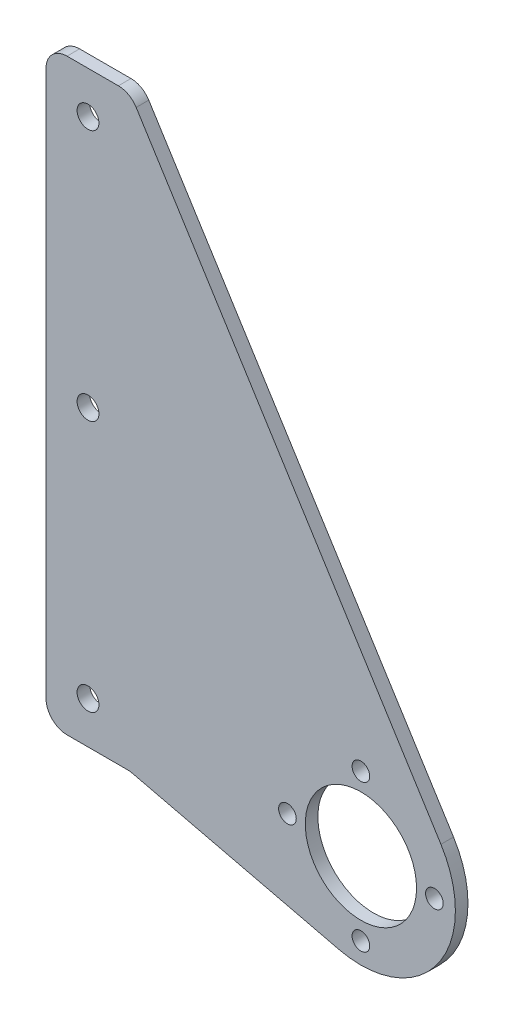
ISO-10303-21;
HEADER;
FILE_DESCRIPTION(('STEP AP214'),'2;1');
FILE_NAME('part.step','',(''),(''),'','','');
FILE_SCHEMA(('AUTOMOTIVE_DESIGN { 1 0 10303 214 1 1 1 1 }'));
ENDSEC;
DATA;
#1=APPLICATION_CONTEXT('core data for automotive mechanical design processes');
#2=APPLICATION_PROTOCOL_DEFINITION('international standard','automotive_design',2000,#1);
#3=PRODUCT_CONTEXT('',#1,'mechanical');
#4=PRODUCT('Part','Part','',(#3));
#5=PRODUCT_RELATED_PRODUCT_CATEGORY('part','',(#4));
#6=PRODUCT_DEFINITION_FORMATION('','',#4);
#7=PRODUCT_DEFINITION_CONTEXT('part definition',#1,'design');
#8=PRODUCT_DEFINITION('design','',#6,#7);
#9=PRODUCT_DEFINITION_SHAPE('','',#8);
#10=(LENGTH_UNIT() NAMED_UNIT(*) SI_UNIT(.MILLI.,.METRE.));
#11=(NAMED_UNIT(*) PLANE_ANGLE_UNIT() SI_UNIT($,.RADIAN.));
#12=(NAMED_UNIT(*) SI_UNIT($,.STERADIAN.) SOLID_ANGLE_UNIT());
#13=UNCERTAINTY_MEASURE_WITH_UNIT(LENGTH_MEASURE(1.E-05),#10,'distance_accuracy_value','');
#14=(GEOMETRIC_REPRESENTATION_CONTEXT(3) GLOBAL_UNCERTAINTY_ASSIGNED_CONTEXT((#13)) GLOBAL_UNIT_ASSIGNED_CONTEXT((#10,
#11,#12)) REPRESENTATION_CONTEXT('',''));
#15=CARTESIAN_POINT('',(0.,0.,0.));
#16=DIRECTION('',(0.,0.,1.));
#17=DIRECTION('',(1.,0.,0.));
#18=AXIS2_PLACEMENT_3D('',#15,#16,#17);
#19=CARTESIAN_POINT('',(0.,0.,3.));
#20=DIRECTION('',(0.,0.,1.));
#21=DIRECTION('',(1.,0.,0.));
#22=AXIS2_PLACEMENT_3D('',#19,#20,#21);
#23=PLANE('',#22);
#24=CARTESIAN_POINT('',(-65.,120.,3.));
#25=DIRECTION('',(0.,0.,1.));
#26=DIRECTION('',(1.,0.,0.));
#27=AXIS2_PLACEMENT_3D('',#24,#25,#26);
#28=CIRCLE('',#27,2.59999999999999);
#29=CARTESIAN_POINT('',(-62.4,120.,3.));
#30=VERTEX_POINT('',#29);
#31=EDGE_CURVE('E343',#30,#30,#28,.T.);
#32=ORIENTED_EDGE('',*,*,#31,.F.);
#33=EDGE_LOOP('',(#32));
#34=FACE_BOUND('',#33,.T.);
#35=CARTESIAN_POINT('',(-17.5,0.,3.));
#36=DIRECTION('',(0.,0.,1.));
#37=DIRECTION('',(1.,0.,0.));
#38=AXIS2_PLACEMENT_3D('',#35,#36,#37);
#39=CIRCLE('',#38,2.1);
#40=CARTESIAN_POINT('',(-15.4,0.,3.));
#41=VERTEX_POINT('',#40);
#42=EDGE_CURVE('E327',#41,#41,#39,.T.);
#43=ORIENTED_EDGE('',*,*,#42,.F.);
#44=EDGE_LOOP('',(#43));
#45=FACE_BOUND('',#44,.T.);
#46=CARTESIAN_POINT('',(17.5,0.,3.));
#47=DIRECTION('',(0.,0.,1.));
#48=DIRECTION('',(1.,0.,0.));
#49=AXIS2_PLACEMENT_3D('',#46,#47,#48);
#50=CIRCLE('',#49,2.1);
#51=CARTESIAN_POINT('',(19.6,0.,3.));
#52=VERTEX_POINT('',#51);
#53=EDGE_CURVE('E311',#52,#52,#50,.T.);
#54=ORIENTED_EDGE('',*,*,#53,.F.);
#55=EDGE_LOOP('',(#54));
#56=FACE_BOUND('',#55,.T.);
#57=CARTESIAN_POINT('',(0.,0.,3.));
#58=DIRECTION('',(0.,0.,1.));
#59=DIRECTION('',(1.,0.,0.));
#60=AXIS2_PLACEMENT_3D('',#57,#58,#59);
#61=CIRCLE('',#60,13.25);
#62=CARTESIAN_POINT('',(13.25,0.,3.));
#63=VERTEX_POINT('',#62);
#64=EDGE_CURVE('E163',#63,#63,#61,.T.);
#65=ORIENTED_EDGE('',*,*,#64,.F.);
#66=EDGE_LOOP('',(#65));
#67=FACE_BOUND('',#66,.T.);
#68=DIRECTION('',(-0.53145870163887,0.847084203873692,0.));
#69=VECTOR('',#68,1.);
#70=CARTESIAN_POINT('',(-55.,130.,3.));
#71=LINE('',#70,#69);
#72=CARTESIAN_POINT('',(19.0593945871581,11.9578207868746,3.));
#73=VERTEX_POINT('',#72);
#74=CARTESIAN_POINT('',(-53.5301912787862,127.657293508194,3.));
#75=VERTEX_POINT('',#74);
#76=EDGE_CURVE('E152',#73,#75,#71,.T.);
#77=ORIENTED_EDGE('',*,*,#76,.T.);
#78=CARTESIAN_POINT('',(-57.7656122981547,125.,3.));
#79=DIRECTION('',(0.,0.,1.));
#80=DIRECTION('',(1.,0.,0.));
#81=AXIS2_PLACEMENT_3D('',#78,#79,#80);
#82=CIRCLE('',#81,5.);
#83=CARTESIAN_POINT('',(-57.7656122981547,130.,3.));
#84=VERTEX_POINT('',#83);
#85=EDGE_CURVE('E215',#75,#84,#82,.T.);
#86=ORIENTED_EDGE('',*,*,#85,.T.);
#87=DIRECTION('',(-1.,0.,0.));
#88=VECTOR('',#87,1.);
#89=CARTESIAN_POINT('',(-75.,130.,3.));
#90=LINE('',#89,#88);
#91=CARTESIAN_POINT('',(-70.,130.,3.));
#92=VERTEX_POINT('',#91);
#93=EDGE_CURVE('E179',#84,#92,#90,.T.);
#94=ORIENTED_EDGE('',*,*,#93,.T.);
#95=CARTESIAN_POINT('',(-70.,125.,3.));
#96=DIRECTION('',(0.,0.,1.));
#97=DIRECTION('',(1.,0.,0.));
#98=AXIS2_PLACEMENT_3D('',#95,#96,#97);
#99=CIRCLE('',#98,5.);
#100=CARTESIAN_POINT('',(-75.,125.,3.));
#101=VERTEX_POINT('',#100);
#102=EDGE_CURVE('E68',#92,#101,#99,.T.);
#103=ORIENTED_EDGE('',*,*,#102,.T.);
#104=DIRECTION('',(0.,-1.,0.));
#105=VECTOR('',#104,1.);
#106=CARTESIAN_POINT('',(-75.,130.,3.));
#107=LINE('',#106,#105);
#108=CARTESIAN_POINT('',(-75.,-5.,3.));
#109=VERTEX_POINT('',#108);
#110=EDGE_CURVE('E285',#101,#109,#107,.T.);
#111=ORIENTED_EDGE('',*,*,#110,.T.);
#112=CARTESIAN_POINT('',(-70.,-5.00000000000001,3.));
#113=DIRECTION('',(0.,0.,1.));
#114=DIRECTION('',(1.,0.,0.));
#115=AXIS2_PLACEMENT_3D('',#112,#113,#114);
#116=CIRCLE('',#115,5.);
#117=CARTESIAN_POINT('',(-70.,-10.,3.));
#118=VERTEX_POINT('',#117);
#119=EDGE_CURVE('E212',#109,#118,#116,.T.);
#120=ORIENTED_EDGE('',*,*,#119,.T.);
#121=DIRECTION('',(1.,0.,0.));
#122=VECTOR('',#121,1.);
#123=CARTESIAN_POINT('',(-75.,-10.,3.));
#124=LINE('',#123,#122);
#125=CARTESIAN_POINT('',(-55.5886578882851,-10.,3.));
#126=VERTEX_POINT('',#125);
#127=EDGE_CURVE('E135',#118,#126,#124,.T.);
#128=ORIENTED_EDGE('',*,*,#127,.T.);
#129=CARTESIAN_POINT('',(-55.5886578882851,-15.,3.));
#130=DIRECTION('',(0.,0.,1.));
#131=DIRECTION('',(1.,0.,0.));
#132=AXIS2_PLACEMENT_3D('',#129,#130,#131);
#133=CIRCLE('',#132,5.);
#134=CARTESIAN_POINT('',(-54.4274374679034,-10.1367123120991,3.));
#135=VERTEX_POINT('',#134);
#136=EDGE_CURVE('E11',#126,#135,#133,.F.);
#137=ORIENTED_EDGE('',*,*,#136,.T.);
#138=DIRECTION('',(0.972657537580184,-0.23224408407633,0.));
#139=VECTOR('',#138,1.);
#140=CARTESIAN_POINT('',(-55.,-10.,3.));
#141=LINE('',#140,#139);
#142=CARTESIAN_POINT('',(-5.22549189171743,-21.8847945955541,3.));
#143=VERTEX_POINT('',#142);
#144=EDGE_CURVE('E122',#135,#143,#141,.T.);
#145=ORIENTED_EDGE('',*,*,#144,.T.);
#146=CARTESIAN_POINT('',(0.,0.,3.));
#147=DIRECTION('',(0.,0.,1.));
#148=DIRECTION('',(1.,0.,0.));
#149=AXIS2_PLACEMENT_3D('',#146,#147,#148);
#150=CIRCLE('',#149,22.5);
#151=EDGE_CURVE('E127',#143,#73,#150,.T.);
#152=ORIENTED_EDGE('',*,*,#151,.T.);
#153=EDGE_LOOP('',(#77,#86,#94,#103,#111,#120,#128,#137,#145,#152));
#154=FACE_BOUND('',#153,.T.);
#155=CARTESIAN_POINT('',(0.,17.5,3.));
#156=DIRECTION('',(0.,0.,1.));
#157=DIRECTION('',(1.,0.,0.));
#158=AXIS2_PLACEMENT_3D('',#155,#156,#157);
#159=CIRCLE('',#158,2.1);
#160=CARTESIAN_POINT('',(2.09999999999993,17.5,3.));
#161=VERTEX_POINT('',#160);
#162=EDGE_CURVE('E303',#161,#161,#159,.T.);
#163=ORIENTED_EDGE('',*,*,#162,.F.);
#164=EDGE_LOOP('',(#163));
#165=FACE_BOUND('',#164,.T.);
#166=CARTESIAN_POINT('',(0.,-17.5,3.));
#167=DIRECTION('',(0.,0.,1.));
#168=DIRECTION('',(1.,0.,0.));
#169=AXIS2_PLACEMENT_3D('',#166,#167,#168);
#170=CIRCLE('',#169,2.1);
#171=CARTESIAN_POINT('',(2.10000000000007,-17.5,3.));
#172=VERTEX_POINT('',#171);
#173=EDGE_CURVE('E319',#172,#172,#170,.T.);
#174=ORIENTED_EDGE('',*,*,#173,.F.);
#175=EDGE_LOOP('',(#174));
#176=FACE_BOUND('',#175,.T.);
#177=CARTESIAN_POINT('',(-65.,60.,3.));
#178=DIRECTION('',(0.,0.,1.));
#179=DIRECTION('',(1.,0.,0.));
#180=AXIS2_PLACEMENT_3D('',#177,#178,#179);
#181=CIRCLE('',#180,2.59999999999999);
#182=CARTESIAN_POINT('',(-62.4,60.,3.));
#183=VERTEX_POINT('',#182);
#184=EDGE_CURVE('E335',#183,#183,#181,.T.);
#185=ORIENTED_EDGE('',*,*,#184,.F.);
#186=EDGE_LOOP('',(#185));
#187=FACE_BOUND('',#186,.T.);
#188=CARTESIAN_POINT('',(-65.,0.,3.));
#189=DIRECTION('',(0.,0.,1.));
#190=DIRECTION('',(1.,0.,0.));
#191=AXIS2_PLACEMENT_3D('',#188,#189,#190);
#192=CIRCLE('',#191,2.59999999999999);
#193=CARTESIAN_POINT('',(-62.4,0.,3.));
#194=VERTEX_POINT('',#193);
#195=EDGE_CURVE('E351',#194,#194,#192,.T.);
#196=ORIENTED_EDGE('',*,*,#195,.F.);
#197=EDGE_LOOP('',(#196));
#198=FACE_BOUND('',#197,.T.);
#199=ADVANCED_FACE('F45',(#34,#45,#56,#67,#154,#165,#176,#187,#198),#23,.T.);
#200=CARTESIAN_POINT('',(0.,0.,0.));
#201=DIRECTION('',(0.,0.,1.));
#202=DIRECTION('',(1.,0.,0.));
#203=AXIS2_PLACEMENT_3D('',#200,#201,#202);
#204=PLANE('',#203);
#205=DIRECTION('',(-1.,0.,0.));
#206=VECTOR('',#205,1.);
#207=CARTESIAN_POINT('',(-75.,130.,0.));
#208=LINE('',#207,#206);
#209=CARTESIAN_POINT('',(-57.7656122981547,130.,0.));
#210=VERTEX_POINT('',#209);
#211=CARTESIAN_POINT('',(-70.,130.,0.));
#212=VERTEX_POINT('',#211);
#213=EDGE_CURVE('E158',#210,#212,#208,.T.);
#214=ORIENTED_EDGE('',*,*,#213,.F.);
#215=CARTESIAN_POINT('',(-57.7656122981547,125.,0.));
#216=DIRECTION('',(0.,0.,1.));
#217=DIRECTION('',(1.,0.,0.));
#218=AXIS2_PLACEMENT_3D('',#215,#216,#217);
#219=CIRCLE('',#218,5.);
#220=CARTESIAN_POINT('',(-53.5301912787862,127.657293508194,0.));
#221=VERTEX_POINT('',#220);
#222=EDGE_CURVE('E204',#210,#221,#219,.F.);
#223=ORIENTED_EDGE('',*,*,#222,.T.);
#224=DIRECTION('',(-0.53145870163887,0.847084203873692,0.));
#225=VECTOR('',#224,1.);
#226=CARTESIAN_POINT('',(-55.,130.,0.));
#227=LINE('',#226,#225);
#228=CARTESIAN_POINT('',(19.0593945871581,11.9578207868746,0.));
#229=VERTEX_POINT('',#228);
#230=EDGE_CURVE('E175',#229,#221,#227,.T.);
#231=ORIENTED_EDGE('',*,*,#230,.F.);
#232=CARTESIAN_POINT('',(0.,0.,0.));
#233=DIRECTION('',(0.,0.,1.));
#234=DIRECTION('',(1.,0.,0.));
#235=AXIS2_PLACEMENT_3D('',#232,#233,#234);
#236=CIRCLE('',#235,22.5);
#237=CARTESIAN_POINT('',(-5.22549189171743,-21.8847945955541,0.));
#238=VERTEX_POINT('',#237);
#239=EDGE_CURVE('E172',#238,#229,#236,.T.);
#240=ORIENTED_EDGE('',*,*,#239,.F.);
#241=DIRECTION('',(0.972657537580184,-0.23224408407633,0.));
#242=VECTOR('',#241,1.);
#243=CARTESIAN_POINT('',(-55.,-10.,0.));
#244=LINE('',#243,#242);
#245=CARTESIAN_POINT('',(-54.4274374679034,-10.1367123120991,0.));
#246=VERTEX_POINT('',#245);
#247=EDGE_CURVE('E141',#246,#238,#244,.T.);
#248=ORIENTED_EDGE('',*,*,#247,.F.);
#249=CARTESIAN_POINT('',(-55.5886578882851,-15.,0.));
#250=DIRECTION('',(0.,0.,1.));
#251=DIRECTION('',(1.,0.,0.));
#252=AXIS2_PLACEMENT_3D('',#249,#250,#251);
#253=CIRCLE('',#252,5.);
#254=CARTESIAN_POINT('',(-55.5886578882851,-10.,0.));
#255=VERTEX_POINT('',#254);
#256=EDGE_CURVE('E54',#246,#255,#253,.T.);
#257=ORIENTED_EDGE('',*,*,#256,.T.);
#258=DIRECTION('',(1.,0.,0.));
#259=VECTOR('',#258,1.);
#260=CARTESIAN_POINT('',(-75.,-10.,0.));
#261=LINE('',#260,#259);
#262=CARTESIAN_POINT('',(-70.,-10.,0.));
#263=VERTEX_POINT('',#262);
#264=EDGE_CURVE('E166',#263,#255,#261,.T.);
#265=ORIENTED_EDGE('',*,*,#264,.F.);
#266=CARTESIAN_POINT('',(-70.,-5.00000000000001,0.));
#267=DIRECTION('',(0.,0.,1.));
#268=DIRECTION('',(1.,0.,0.));
#269=AXIS2_PLACEMENT_3D('',#266,#267,#268);
#270=CIRCLE('',#269,5.);
#271=CARTESIAN_POINT('',(-75.,-5.,0.));
#272=VERTEX_POINT('',#271);
#273=EDGE_CURVE('E201',#263,#272,#270,.F.);
#274=ORIENTED_EDGE('',*,*,#273,.T.);
#275=DIRECTION('',(0.,-1.,0.));
#276=VECTOR('',#275,1.);
#277=CARTESIAN_POINT('',(-75.,130.,0.));
#278=LINE('',#277,#276);
#279=CARTESIAN_POINT('',(-75.,125.,0.));
#280=VERTEX_POINT('',#279);
#281=EDGE_CURVE('E162',#280,#272,#278,.T.);
#282=ORIENTED_EDGE('',*,*,#281,.F.);
#283=CARTESIAN_POINT('',(-70.,125.,0.));
#284=DIRECTION('',(0.,0.,1.));
#285=DIRECTION('',(1.,0.,0.));
#286=AXIS2_PLACEMENT_3D('',#283,#284,#285);
#287=CIRCLE('',#286,5.);
#288=EDGE_CURVE('E198',#280,#212,#287,.F.);
#289=ORIENTED_EDGE('',*,*,#288,.T.);
#290=EDGE_LOOP('',(#214,#223,#231,#240,#248,#257,#265,#274,#282,#289));
#291=FACE_BOUND('',#290,.T.);
#292=CARTESIAN_POINT('',(0.,0.,0.));
#293=DIRECTION('',(0.,0.,1.));
#294=DIRECTION('',(1.,0.,0.));
#295=AXIS2_PLACEMENT_3D('',#292,#293,#294);
#296=CIRCLE('',#295,13.25);
#297=CARTESIAN_POINT('',(13.25,0.,0.));
#298=VERTEX_POINT('',#297);
#299=EDGE_CURVE('E299',#298,#298,#296,.T.);
#300=ORIENTED_EDGE('',*,*,#299,.T.);
#301=EDGE_LOOP('',(#300));
#302=FACE_BOUND('',#301,.T.);
#303=CARTESIAN_POINT('',(0.,17.5,0.));
#304=DIRECTION('',(0.,0.,1.));
#305=DIRECTION('',(1.,0.,0.));
#306=AXIS2_PLACEMENT_3D('',#303,#304,#305);
#307=CIRCLE('',#306,2.1);
#308=CARTESIAN_POINT('',(2.09999999999993,17.5,0.));
#309=VERTEX_POINT('',#308);
#310=EDGE_CURVE('E307',#309,#309,#307,.T.);
#311=ORIENTED_EDGE('',*,*,#310,.T.);
#312=EDGE_LOOP('',(#311));
#313=FACE_BOUND('',#312,.T.);
#314=CARTESIAN_POINT('',(17.5,0.,0.));
#315=DIRECTION('',(0.,0.,1.));
#316=DIRECTION('',(1.,0.,0.));
#317=AXIS2_PLACEMENT_3D('',#314,#315,#316);
#318=CIRCLE('',#317,2.1);
#319=CARTESIAN_POINT('',(19.6,0.,0.));
#320=VERTEX_POINT('',#319);
#321=EDGE_CURVE('E315',#320,#320,#318,.T.);
#322=ORIENTED_EDGE('',*,*,#321,.T.);
#323=EDGE_LOOP('',(#322));
#324=FACE_BOUND('',#323,.T.);
#325=CARTESIAN_POINT('',(0.,-17.5,0.));
#326=DIRECTION('',(0.,0.,1.));
#327=DIRECTION('',(1.,0.,0.));
#328=AXIS2_PLACEMENT_3D('',#325,#326,#327);
#329=CIRCLE('',#328,2.1);
#330=CARTESIAN_POINT('',(2.10000000000007,-17.5,0.));
#331=VERTEX_POINT('',#330);
#332=EDGE_CURVE('E323',#331,#331,#329,.T.);
#333=ORIENTED_EDGE('',*,*,#332,.T.);
#334=EDGE_LOOP('',(#333));
#335=FACE_BOUND('',#334,.T.);
#336=CARTESIAN_POINT('',(-17.5,0.,0.));
#337=DIRECTION('',(0.,0.,1.));
#338=DIRECTION('',(1.,0.,0.));
#339=AXIS2_PLACEMENT_3D('',#336,#337,#338);
#340=CIRCLE('',#339,2.1);
#341=CARTESIAN_POINT('',(-15.4,0.,0.));
#342=VERTEX_POINT('',#341);
#343=EDGE_CURVE('E331',#342,#342,#340,.T.);
#344=ORIENTED_EDGE('',*,*,#343,.T.);
#345=EDGE_LOOP('',(#344));
#346=FACE_BOUND('',#345,.T.);
#347=CARTESIAN_POINT('',(-65.,60.,0.));
#348=DIRECTION('',(0.,0.,1.));
#349=DIRECTION('',(1.,0.,0.));
#350=AXIS2_PLACEMENT_3D('',#347,#348,#349);
#351=CIRCLE('',#350,2.59999999999999);
#352=CARTESIAN_POINT('',(-62.4,60.,0.));
#353=VERTEX_POINT('',#352);
#354=EDGE_CURVE('E339',#353,#353,#351,.T.);
#355=ORIENTED_EDGE('',*,*,#354,.T.);
#356=EDGE_LOOP('',(#355));
#357=FACE_BOUND('',#356,.T.);
#358=CARTESIAN_POINT('',(-65.,120.,0.));
#359=DIRECTION('',(0.,0.,1.));
#360=DIRECTION('',(1.,0.,0.));
#361=AXIS2_PLACEMENT_3D('',#358,#359,#360);
#362=CIRCLE('',#361,2.59999999999999);
#363=CARTESIAN_POINT('',(-62.4,120.,0.));
#364=VERTEX_POINT('',#363);
#365=EDGE_CURVE('E347',#364,#364,#362,.T.);
#366=ORIENTED_EDGE('',*,*,#365,.T.);
#367=EDGE_LOOP('',(#366));
#368=FACE_BOUND('',#367,.T.);
#369=CARTESIAN_POINT('',(-65.,0.,0.));
#370=DIRECTION('',(0.,0.,1.));
#371=DIRECTION('',(1.,0.,0.));
#372=AXIS2_PLACEMENT_3D('',#369,#370,#371);
#373=CIRCLE('',#372,2.59999999999999);
#374=CARTESIAN_POINT('',(-62.4,0.,0.));
#375=VERTEX_POINT('',#374);
#376=EDGE_CURVE('E355',#375,#375,#373,.T.);
#377=ORIENTED_EDGE('',*,*,#376,.T.);
#378=EDGE_LOOP('',(#377));
#379=FACE_BOUND('',#378,.T.);
#380=ADVANCED_FACE('F227',(#291,#302,#313,#324,#335,#346,#357,#368,#379),#204,.F.);
#381=CARTESIAN_POINT('',(-75.,130.,3.));
#382=DIRECTION('',(0.,-1.,0.));
#383=DIRECTION('',(0.,0.,-1.));
#384=AXIS2_PLACEMENT_3D('',#381,#382,#383);
#385=PLANE('',#384);
#386=ORIENTED_EDGE('',*,*,#93,.F.);
#387=DIRECTION('',(0.,0.,-1.));
#388=VECTOR('',#387,1.);
#389=CARTESIAN_POINT('',(-57.7656122981547,130.,3.));
#390=LINE('',#389,#388);
#391=EDGE_CURVE('E194',#84,#210,#390,.T.);
#392=ORIENTED_EDGE('',*,*,#391,.T.);
#393=ORIENTED_EDGE('',*,*,#213,.T.);
#394=DIRECTION('',(0.,0.,-1.));
#395=VECTOR('',#394,1.);
#396=CARTESIAN_POINT('',(-70.,130.,3.));
#397=LINE('',#396,#395);
#398=EDGE_CURVE('E191',#212,#92,#397,.F.);
#399=ORIENTED_EDGE('',*,*,#398,.T.);
#400=EDGE_LOOP('',(#386,#392,#393,#399));
#401=FACE_BOUND('',#400,.T.);
#402=ADVANCED_FACE('F258',(#401),#385,.F.);
#403=CARTESIAN_POINT('',(-75.,130.,3.));
#404=DIRECTION('',(1.,0.,0.));
#405=DIRECTION('',(0.,1.,0.));
#406=AXIS2_PLACEMENT_3D('',#403,#404,#405);
#407=PLANE('',#406);
#408=ORIENTED_EDGE('',*,*,#281,.T.);
#409=DIRECTION('',(0.,0.,-1.));
#410=VECTOR('',#409,1.);
#411=CARTESIAN_POINT('',(-75.,-5.,3.));
#412=LINE('',#411,#410);
#413=EDGE_CURVE('E61',#272,#109,#412,.F.);
#414=ORIENTED_EDGE('',*,*,#413,.T.);
#415=ORIENTED_EDGE('',*,*,#110,.F.);
#416=DIRECTION('',(0.,0.,-1.));
#417=VECTOR('',#416,1.);
#418=CARTESIAN_POINT('',(-75.,125.,3.));
#419=LINE('',#418,#417);
#420=EDGE_CURVE('E218',#101,#280,#419,.T.);
#421=ORIENTED_EDGE('',*,*,#420,.T.);
#422=EDGE_LOOP('',(#408,#414,#415,#421));
#423=FACE_BOUND('',#422,.T.);
#424=ADVANCED_FACE('F275',(#423),#407,.F.);
#425=CARTESIAN_POINT('',(-75.,-10.,3.));
#426=DIRECTION('',(0.,1.,0.));
#427=DIRECTION('',(-1.,0.,0.));
#428=AXIS2_PLACEMENT_3D('',#425,#426,#427);
#429=PLANE('',#428);
#430=ORIENTED_EDGE('',*,*,#264,.T.);
#431=DIRECTION('',(0.,0.,-1.));
#432=VECTOR('',#431,1.);
#433=CARTESIAN_POINT('',(-55.5886578882851,-10.,3.));
#434=LINE('',#433,#432);
#435=EDGE_CURVE('E188',#255,#126,#434,.F.);
#436=ORIENTED_EDGE('',*,*,#435,.T.);
#437=ORIENTED_EDGE('',*,*,#127,.F.);
#438=DIRECTION('',(0.,0.,-1.));
#439=VECTOR('',#438,1.);
#440=CARTESIAN_POINT('',(-70.,-10.,3.));
#441=LINE('',#440,#439);
#442=EDGE_CURVE('E184',#118,#263,#441,.T.);
#443=ORIENTED_EDGE('',*,*,#442,.T.);
#444=EDGE_LOOP('',(#430,#436,#437,#443));
#445=FACE_BOUND('',#444,.T.);
#446=ADVANCED_FACE('F232',(#445),#429,.F.);
#447=CARTESIAN_POINT('',(-55.,-10.,3.));
#448=DIRECTION('',(0.23224408407633,0.972657537580184,0.));
#449=DIRECTION('',(-0.972657537580184,0.23224408407633,0.));
#450=AXIS2_PLACEMENT_3D('',#447,#448,#449);
#451=PLANE('',#450);
#452=ORIENTED_EDGE('',*,*,#144,.F.);
#453=DIRECTION('',(0.,0.,-1.));
#454=VECTOR('',#453,1.);
#455=CARTESIAN_POINT('',(-54.4274374679034,-10.1367123120991,0.));
#456=LINE('',#455,#454);
#457=EDGE_CURVE('E145',#135,#246,#456,.T.);
#458=ORIENTED_EDGE('',*,*,#457,.T.);
#459=ORIENTED_EDGE('',*,*,#247,.T.);
#460=DIRECTION('',(0.,0.,-1.));
#461=VECTOR('',#460,1.);
#462=CARTESIAN_POINT('',(-5.22549189171743,-21.8847945955541,3.));
#463=LINE('',#462,#461);
#464=EDGE_CURVE('E138',#143,#238,#463,.T.);
#465=ORIENTED_EDGE('',*,*,#464,.F.);
#466=EDGE_LOOP('',(#452,#458,#459,#465));
#467=FACE_BOUND('',#466,.T.);
#468=ADVANCED_FACE('F139',(#467),#451,.F.);
#469=CARTESIAN_POINT('',(0.,0.,3.));
#470=DIRECTION('',(0.,0.,-1.));
#471=DIRECTION('',(-1.,0.,0.));
#472=AXIS2_PLACEMENT_3D('',#469,#470,#471);
#473=CYLINDRICAL_SURFACE('',#472,22.5);
#474=ORIENTED_EDGE('',*,*,#239,.T.);
#475=DIRECTION('',(0.,0.,-1.));
#476=VECTOR('',#475,1.);
#477=CARTESIAN_POINT('',(19.0593945871581,11.9578207868746,3.));
#478=LINE('',#477,#476);
#479=EDGE_CURVE('E146',#73,#229,#478,.T.);
#480=ORIENTED_EDGE('',*,*,#479,.F.);
#481=ORIENTED_EDGE('',*,*,#151,.F.);
#482=ORIENTED_EDGE('',*,*,#464,.T.);
#483=EDGE_LOOP('',(#474,#480,#481,#482));
#484=FACE_BOUND('',#483,.T.);
#485=ADVANCED_FACE('F148',(#484),#473,.T.);
#486=CARTESIAN_POINT('',(-55.,130.,3.));
#487=DIRECTION('',(-0.847084203873692,-0.53145870163887,0.));
#488=DIRECTION('',(0.53145870163887,-0.847084203873692,0.));
#489=AXIS2_PLACEMENT_3D('',#486,#487,#488);
#490=PLANE('',#489);
#491=ORIENTED_EDGE('',*,*,#230,.T.);
#492=DIRECTION('',(0.,0.,-1.));
#493=VECTOR('',#492,1.);
#494=CARTESIAN_POINT('',(-53.5301912787862,127.657293508194,3.));
#495=LINE('',#494,#493);
#496=EDGE_CURVE('E207',#221,#75,#495,.F.);
#497=ORIENTED_EDGE('',*,*,#496,.T.);
#498=ORIENTED_EDGE('',*,*,#76,.F.);
#499=ORIENTED_EDGE('',*,*,#479,.T.);
#500=EDGE_LOOP('',(#491,#497,#498,#499));
#501=FACE_BOUND('',#500,.T.);
#502=ADVANCED_FACE('F266',(#501),#490,.F.);
#503=CARTESIAN_POINT('',(0.,0.,3.));
#504=DIRECTION('',(0.,0.,-1.));
#505=DIRECTION('',(-1.,0.,0.));
#506=AXIS2_PLACEMENT_3D('',#503,#504,#505);
#507=CYLINDRICAL_SURFACE('',#506,13.25);
#508=ORIENTED_EDGE('',*,*,#64,.T.);
#509=EDGE_LOOP('',(#508));
#510=FACE_BOUND('',#509,.T.);
#511=ORIENTED_EDGE('',*,*,#299,.F.);
#512=EDGE_LOOP('',(#511));
#513=FACE_BOUND('',#512,.T.);
#514=ADVANCED_FACE('F263',(#510,#513),#507,.F.);
#515=CARTESIAN_POINT('',(0.,17.5,3.));
#516=DIRECTION('',(0.,0.,-1.));
#517=DIRECTION('',(-1.,0.,0.));
#518=AXIS2_PLACEMENT_3D('',#515,#516,#517);
#519=CYLINDRICAL_SURFACE('',#518,2.1);
#520=ORIENTED_EDGE('',*,*,#162,.T.);
#521=EDGE_LOOP('',(#520));
#522=FACE_BOUND('',#521,.T.);
#523=ORIENTED_EDGE('',*,*,#310,.F.);
#524=EDGE_LOOP('',(#523));
#525=FACE_BOUND('',#524,.T.);
#526=ADVANCED_FACE('F389',(#522,#525),#519,.F.);
#527=CARTESIAN_POINT('',(17.5,0.,3.));
#528=DIRECTION('',(0.,0.,-1.));
#529=DIRECTION('',(-1.,0.,0.));
#530=AXIS2_PLACEMENT_3D('',#527,#528,#529);
#531=CYLINDRICAL_SURFACE('',#530,2.1);
#532=ORIENTED_EDGE('',*,*,#53,.T.);
#533=EDGE_LOOP('',(#532));
#534=FACE_BOUND('',#533,.T.);
#535=ORIENTED_EDGE('',*,*,#321,.F.);
#536=EDGE_LOOP('',(#535));
#537=FACE_BOUND('',#536,.T.);
#538=ADVANCED_FACE('F386',(#534,#537),#531,.F.);
#539=CARTESIAN_POINT('',(0.,-17.5,3.));
#540=DIRECTION('',(0.,0.,-1.));
#541=DIRECTION('',(-1.,0.,0.));
#542=AXIS2_PLACEMENT_3D('',#539,#540,#541);
#543=CYLINDRICAL_SURFACE('',#542,2.1);
#544=ORIENTED_EDGE('',*,*,#173,.T.);
#545=EDGE_LOOP('',(#544));
#546=FACE_BOUND('',#545,.T.);
#547=ORIENTED_EDGE('',*,*,#332,.F.);
#548=EDGE_LOOP('',(#547));
#549=FACE_BOUND('',#548,.T.);
#550=ADVANCED_FACE('F382',(#546,#549),#543,.F.);
#551=CARTESIAN_POINT('',(-17.5,0.,3.));
#552=DIRECTION('',(0.,0.,-1.));
#553=DIRECTION('',(-1.,0.,0.));
#554=AXIS2_PLACEMENT_3D('',#551,#552,#553);
#555=CYLINDRICAL_SURFACE('',#554,2.1);
#556=ORIENTED_EDGE('',*,*,#42,.T.);
#557=EDGE_LOOP('',(#556));
#558=FACE_BOUND('',#557,.T.);
#559=ORIENTED_EDGE('',*,*,#343,.F.);
#560=EDGE_LOOP('',(#559));
#561=FACE_BOUND('',#560,.T.);
#562=ADVANCED_FACE('F376',(#558,#561),#555,.F.);
#563=CARTESIAN_POINT('',(-65.,60.,3.));
#564=DIRECTION('',(0.,0.,-1.));
#565=DIRECTION('',(-1.,0.,0.));
#566=AXIS2_PLACEMENT_3D('',#563,#564,#565);
#567=CYLINDRICAL_SURFACE('',#566,2.59999999999999);
#568=ORIENTED_EDGE('',*,*,#184,.T.);
#569=EDGE_LOOP('',(#568));
#570=FACE_BOUND('',#569,.T.);
#571=ORIENTED_EDGE('',*,*,#354,.F.);
#572=EDGE_LOOP('',(#571));
#573=FACE_BOUND('',#572,.T.);
#574=ADVANCED_FACE('F369',(#570,#573),#567,.F.);
#575=CARTESIAN_POINT('',(-65.,120.,3.));
#576=DIRECTION('',(0.,0.,-1.));
#577=DIRECTION('',(-1.,0.,0.));
#578=AXIS2_PLACEMENT_3D('',#575,#576,#577);
#579=CYLINDRICAL_SURFACE('',#578,2.59999999999999);
#580=ORIENTED_EDGE('',*,*,#31,.T.);
#581=EDGE_LOOP('',(#580));
#582=FACE_BOUND('',#581,.T.);
#583=ORIENTED_EDGE('',*,*,#365,.F.);
#584=EDGE_LOOP('',(#583));
#585=FACE_BOUND('',#584,.T.);
#586=ADVANCED_FACE('F248',(#582,#585),#579,.F.);
#587=CARTESIAN_POINT('',(-65.,0.,3.));
#588=DIRECTION('',(0.,0.,-1.));
#589=DIRECTION('',(-1.,0.,0.));
#590=AXIS2_PLACEMENT_3D('',#587,#588,#589);
#591=CYLINDRICAL_SURFACE('',#590,2.59999999999999);
#592=ORIENTED_EDGE('',*,*,#195,.T.);
#593=EDGE_LOOP('',(#592));
#594=FACE_BOUND('',#593,.T.);
#595=ORIENTED_EDGE('',*,*,#376,.F.);
#596=EDGE_LOOP('',(#595));
#597=FACE_BOUND('',#596,.T.);
#598=ADVANCED_FACE('F238',(#594,#597),#591,.F.);
#599=CARTESIAN_POINT('',(-55.5886578882851,-15.,3.));
#600=DIRECTION('',(0.,0.,1.));
#601=DIRECTION('',(1.,0.,0.));
#602=AXIS2_PLACEMENT_3D('',#599,#600,#601);
#603=CYLINDRICAL_SURFACE('',#602,5.);
#604=ORIENTED_EDGE('',*,*,#136,.F.);
#605=ORIENTED_EDGE('',*,*,#435,.F.);
#606=ORIENTED_EDGE('',*,*,#256,.F.);
#607=ORIENTED_EDGE('',*,*,#457,.F.);
#608=EDGE_LOOP('',(#604,#605,#606,#607));
#609=FACE_BOUND('',#608,.T.);
#610=ADVANCED_FACE('F235',(#609),#603,.F.);
#611=CARTESIAN_POINT('',(-57.7656122981547,125.,3.));
#612=DIRECTION('',(0.,0.,-1.));
#613=DIRECTION('',(-1.,0.,0.));
#614=AXIS2_PLACEMENT_3D('',#611,#612,#613);
#615=CYLINDRICAL_SURFACE('',#614,5.);
#616=ORIENTED_EDGE('',*,*,#85,.F.);
#617=ORIENTED_EDGE('',*,*,#496,.F.);
#618=ORIENTED_EDGE('',*,*,#222,.F.);
#619=ORIENTED_EDGE('',*,*,#391,.F.);
#620=EDGE_LOOP('',(#616,#617,#618,#619));
#621=FACE_BOUND('',#620,.T.);
#622=ADVANCED_FACE('F237',(#621),#615,.T.);
#623=CARTESIAN_POINT('',(-70.,-5.00000000000001,3.));
#624=DIRECTION('',(0.,0.,-1.));
#625=DIRECTION('',(-1.,0.,0.));
#626=AXIS2_PLACEMENT_3D('',#623,#624,#625);
#627=CYLINDRICAL_SURFACE('',#626,5.);
#628=ORIENTED_EDGE('',*,*,#119,.F.);
#629=ORIENTED_EDGE('',*,*,#413,.F.);
#630=ORIENTED_EDGE('',*,*,#273,.F.);
#631=ORIENTED_EDGE('',*,*,#442,.F.);
#632=EDGE_LOOP('',(#628,#629,#630,#631));
#633=FACE_BOUND('',#632,.T.);
#634=ADVANCED_FACE('F244',(#633),#627,.T.);
#635=CARTESIAN_POINT('',(-70.,125.,3.));
#636=DIRECTION('',(0.,0.,-1.));
#637=DIRECTION('',(-1.,0.,0.));
#638=AXIS2_PLACEMENT_3D('',#635,#636,#637);
#639=CYLINDRICAL_SURFACE('',#638,5.);
#640=ORIENTED_EDGE('',*,*,#102,.F.);
#641=ORIENTED_EDGE('',*,*,#398,.F.);
#642=ORIENTED_EDGE('',*,*,#288,.F.);
#643=ORIENTED_EDGE('',*,*,#420,.F.);
#644=EDGE_LOOP('',(#640,#641,#642,#643));
#645=FACE_BOUND('',#644,.T.);
#646=ADVANCED_FACE('F47',(#645),#639,.T.);
#647=CLOSED_SHELL('',(#199,#380,#402,#424,#446,#468,#485,#502,#514,#526,#538,#550,#562,#574,
#586,#598,#610,#622,#634,#646));
#648=MANIFOLD_SOLID_BREP('B2',#647);
#649=ADVANCED_BREP_SHAPE_REPRESENTATION('',(#18,#648),#14);
#650=SHAPE_DEFINITION_REPRESENTATION(#9,#649);
ENDSEC;
END-ISO-10303-21;
